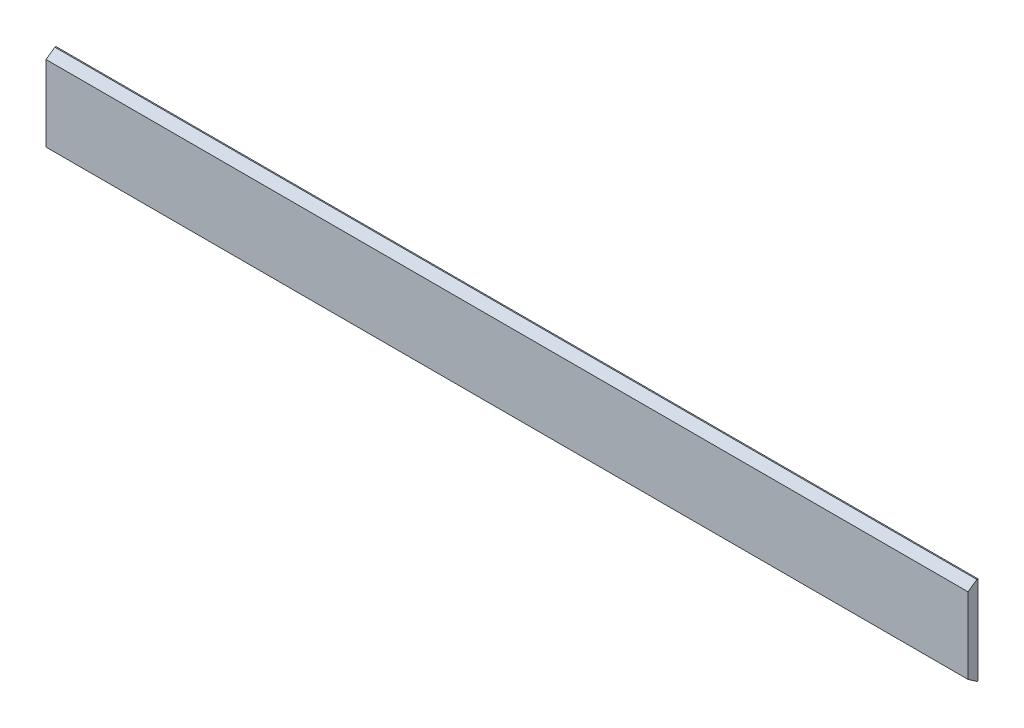
ISO-10303-21;
HEADER;
FILE_DESCRIPTION(('STEP AP214'),'2;1');
FILE_NAME('part.step','',(''),(''),'','','');
FILE_SCHEMA(('AUTOMOTIVE_DESIGN { 1 0 10303 214 1 1 1 1 }'));
ENDSEC;
DATA;
#1=APPLICATION_CONTEXT('core data for automotive mechanical design processes');
#2=APPLICATION_PROTOCOL_DEFINITION('international standard','automotive_design',2000,#1);
#3=PRODUCT_CONTEXT('',#1,'mechanical');
#4=PRODUCT('Part','Part','',(#3));
#5=PRODUCT_RELATED_PRODUCT_CATEGORY('part','',(#4));
#6=PRODUCT_DEFINITION_FORMATION('','',#4);
#7=PRODUCT_DEFINITION_CONTEXT('part definition',#1,'design');
#8=PRODUCT_DEFINITION('design','',#6,#7);
#9=PRODUCT_DEFINITION_SHAPE('','',#8);
#10=(LENGTH_UNIT() NAMED_UNIT(*) SI_UNIT(.MILLI.,.METRE.));
#11=(NAMED_UNIT(*) PLANE_ANGLE_UNIT() SI_UNIT($,.RADIAN.));
#12=(NAMED_UNIT(*) SI_UNIT($,.STERADIAN.) SOLID_ANGLE_UNIT());
#13=UNCERTAINTY_MEASURE_WITH_UNIT(LENGTH_MEASURE(1.E-05),#10,'distance_accuracy_value','');
#14=(GEOMETRIC_REPRESENTATION_CONTEXT(3) GLOBAL_UNCERTAINTY_ASSIGNED_CONTEXT((#13)) GLOBAL_UNIT_ASSIGNED_CONTEXT((#10,
#11,#12)) REPRESENTATION_CONTEXT('',''));
#15=CARTESIAN_POINT('',(0.,0.,0.));
#16=DIRECTION('',(0.,0.,1.));
#17=DIRECTION('',(1.,0.,0.));
#18=AXIS2_PLACEMENT_3D('',#15,#16,#17);
#19=CARTESIAN_POINT('',(830.,79.5,18.));
#20=DIRECTION('',(-1.,0.,0.));
#21=DIRECTION('',(0.,-1.,0.));
#22=AXIS2_PLACEMENT_3D('',#19,#20,#21);
#23=PLANE('',#22);
#24=DIRECTION('',(0.,1.,0.));
#25=VECTOR('',#24,1.);
#26=CARTESIAN_POINT('',(830.,79.5,18.));
#27=LINE('',#26,#25);
#28=CARTESIAN_POINT('',(830.,-68.2966793886447,18.));
#29=VERTEX_POINT('',#28);
#30=CARTESIAN_POINT('',(830.,68.2966793886448,18.));
#31=VERTEX_POINT('',#30);
#32=EDGE_CURVE('E120',#29,#31,#27,.T.);
#33=ORIENTED_EDGE('',*,*,#32,.F.);
#34=DIRECTION('',(0.,-0.573576436351041,-0.819152044288996));
#35=VECTOR('',#34,1.);
#36=CARTESIAN_POINT('',(830.,-68.296679388645,17.9999999999997));
#37=LINE('',#36,#35);
#38=CARTESIAN_POINT('',(830.,-79.5,1.99999999999998));
#39=VERTEX_POINT('',#38);
#40=EDGE_CURVE('E59',#29,#39,#37,.T.);
#41=ORIENTED_EDGE('',*,*,#40,.T.);
#42=DIRECTION('',(0.,0.,-1.));
#43=VECTOR('',#42,1.);
#44=CARTESIAN_POINT('',(830.,-79.5,18.));
#45=LINE('',#44,#43);
#46=CARTESIAN_POINT('',(830.,-79.5,0.));
#47=VERTEX_POINT('',#46);
#48=EDGE_CURVE('E110',#39,#47,#45,.T.);
#49=ORIENTED_EDGE('',*,*,#48,.T.);
#50=DIRECTION('',(0.,1.,0.));
#51=VECTOR('',#50,1.);
#52=CARTESIAN_POINT('',(830.,79.5,0.));
#53=LINE('',#52,#51);
#54=CARTESIAN_POINT('',(830.,79.5,0.));
#55=VERTEX_POINT('',#54);
#56=EDGE_CURVE('E106',#47,#55,#53,.T.);
#57=ORIENTED_EDGE('',*,*,#56,.T.);
#58=DIRECTION('',(0.,0.,-1.));
#59=VECTOR('',#58,1.);
#60=CARTESIAN_POINT('',(830.,79.5,18.));
#61=LINE('',#60,#59);
#62=CARTESIAN_POINT('',(830.,79.5,1.99999999999998));
#63=VERTEX_POINT('',#62);
#64=EDGE_CURVE('E88',#63,#55,#61,.T.);
#65=ORIENTED_EDGE('',*,*,#64,.F.);
#66=DIRECTION('',(0.,-0.573576436351041,0.819152044288996));
#67=VECTOR('',#66,1.);
#68=CARTESIAN_POINT('',(830.,68.2966793886446,18.0000000000003));
#69=LINE('',#68,#67);
#70=EDGE_CURVE('E130',#63,#31,#69,.T.);
#71=ORIENTED_EDGE('',*,*,#70,.T.);
#72=EDGE_LOOP('',(#33,#41,#49,#57,#65,#71));
#73=FACE_BOUND('',#72,.T.);
#74=ADVANCED_FACE('F37',(#73),#23,.F.);
#75=CARTESIAN_POINT('',(-830.,79.5,18.));
#76=DIRECTION('',(0.,-1.,0.));
#77=DIRECTION('',(0.,0.,-1.));
#78=AXIS2_PLACEMENT_3D('',#75,#76,#77);
#79=PLANE('',#78);
#80=DIRECTION('',(0.,0.,-1.));
#81=VECTOR('',#80,1.);
#82=CARTESIAN_POINT('',(-830.,79.5,18.));
#83=LINE('',#82,#81);
#84=CARTESIAN_POINT('',(-830.,79.5,1.99999999999998));
#85=VERTEX_POINT('',#84);
#86=CARTESIAN_POINT('',(-830.,79.5,0.));
#87=VERTEX_POINT('',#86);
#88=EDGE_CURVE('E100',#85,#87,#83,.T.);
#89=ORIENTED_EDGE('',*,*,#88,.F.);
#90=DIRECTION('',(1.,0.,0.));
#91=VECTOR('',#90,1.);
#92=CARTESIAN_POINT('',(830.,79.5,1.99999999999998));
#93=LINE('',#92,#91);
#94=EDGE_CURVE('E95',#85,#63,#93,.T.);
#95=ORIENTED_EDGE('',*,*,#94,.T.);
#96=ORIENTED_EDGE('',*,*,#64,.T.);
#97=DIRECTION('',(-1.,0.,0.));
#98=VECTOR('',#97,1.);
#99=CARTESIAN_POINT('',(-830.,79.5,0.));
#100=LINE('',#99,#98);
#101=EDGE_CURVE('E92',#55,#87,#100,.T.);
#102=ORIENTED_EDGE('',*,*,#101,.T.);
#103=EDGE_LOOP('',(#89,#95,#96,#102));
#104=FACE_BOUND('',#103,.T.);
#105=ADVANCED_FACE('F91',(#104),#79,.F.);
#106=CARTESIAN_POINT('',(-830.,79.5,18.));
#107=DIRECTION('',(1.,0.,0.));
#108=DIRECTION('',(0.,1.,0.));
#109=AXIS2_PLACEMENT_3D('',#106,#107,#108);
#110=PLANE('',#109);
#111=DIRECTION('',(0.,0.,-1.));
#112=VECTOR('',#111,1.);
#113=CARTESIAN_POINT('',(-830.,-79.5,18.));
#114=LINE('',#113,#112);
#115=CARTESIAN_POINT('',(-830.,-79.5,1.99999999999998));
#116=VERTEX_POINT('',#115);
#117=CARTESIAN_POINT('',(-830.,-79.5,0.));
#118=VERTEX_POINT('',#117);
#119=EDGE_CURVE('E122',#116,#118,#114,.T.);
#120=ORIENTED_EDGE('',*,*,#119,.F.);
#121=DIRECTION('',(0.,0.573576436351041,0.819152044288996));
#122=VECTOR('',#121,1.);
#123=CARTESIAN_POINT('',(-830.,-68.2966793886446,18.0000000000003));
#124=LINE('',#123,#122);
#125=CARTESIAN_POINT('',(-830.,-68.2966793886447,18.));
#126=VERTEX_POINT('',#125);
#127=EDGE_CURVE('E11',#116,#126,#124,.T.);
#128=ORIENTED_EDGE('',*,*,#127,.T.);
#129=DIRECTION('',(0.,-1.,0.));
#130=VECTOR('',#129,1.);
#131=CARTESIAN_POINT('',(-830.,79.5,18.));
#132=LINE('',#131,#130);
#133=CARTESIAN_POINT('',(-830.,68.2966793886448,18.));
#134=VERTEX_POINT('',#133);
#135=EDGE_CURVE('E114',#134,#126,#132,.T.);
#136=ORIENTED_EDGE('',*,*,#135,.F.);
#137=DIRECTION('',(0.,0.573576436351041,-0.819152044288996));
#138=VECTOR('',#137,1.);
#139=CARTESIAN_POINT('',(-830.,68.296679388645,17.9999999999997));
#140=LINE('',#139,#138);
#141=EDGE_CURVE('E127',#134,#85,#140,.T.);
#142=ORIENTED_EDGE('',*,*,#141,.T.);
#143=ORIENTED_EDGE('',*,*,#88,.T.);
#144=DIRECTION('',(0.,-1.,0.));
#145=VECTOR('',#144,1.);
#146=CARTESIAN_POINT('',(-830.,79.5,0.));
#147=LINE('',#146,#145);
#148=EDGE_CURVE('E108',#87,#118,#147,.T.);
#149=ORIENTED_EDGE('',*,*,#148,.T.);
#150=EDGE_LOOP('',(#120,#128,#136,#142,#143,#149));
#151=FACE_BOUND('',#150,.T.);
#152=ADVANCED_FACE('F146',(#151),#110,.F.);
#153=CARTESIAN_POINT('',(-830.,-79.5,18.));
#154=DIRECTION('',(0.,1.,0.));
#155=DIRECTION('',(0.,0.,1.));
#156=AXIS2_PLACEMENT_3D('',#153,#154,#155);
#157=PLANE('',#156);
#158=ORIENTED_EDGE('',*,*,#48,.F.);
#159=DIRECTION('',(-1.,0.,0.));
#160=VECTOR('',#159,1.);
#161=CARTESIAN_POINT('',(-830.,-79.5,1.99999999999998));
#162=LINE('',#161,#160);
#163=EDGE_CURVE('E45',#39,#116,#162,.T.);
#164=ORIENTED_EDGE('',*,*,#163,.T.);
#165=ORIENTED_EDGE('',*,*,#119,.T.);
#166=DIRECTION('',(1.,0.,0.));
#167=VECTOR('',#166,1.);
#168=CARTESIAN_POINT('',(-830.,-79.5,0.));
#169=LINE('',#168,#167);
#170=EDGE_CURVE('E118',#118,#47,#169,.T.);
#171=ORIENTED_EDGE('',*,*,#170,.T.);
#172=EDGE_LOOP('',(#158,#164,#165,#171));
#173=FACE_BOUND('',#172,.T.);
#174=ADVANCED_FACE('F160',(#173),#157,.F.);
#175=CARTESIAN_POINT('',(0.,0.,18.));
#176=DIRECTION('',(0.,0.,1.));
#177=DIRECTION('',(1.,0.,0.));
#178=AXIS2_PLACEMENT_3D('',#175,#176,#177);
#179=PLANE('',#178);
#180=ORIENTED_EDGE('',*,*,#135,.T.);
#181=DIRECTION('',(1.,0.,0.));
#182=VECTOR('',#181,1.);
#183=CARTESIAN_POINT('',(830.,-68.2966793886448,18.));
#184=LINE('',#183,#182);
#185=EDGE_CURVE('E132',#126,#29,#184,.T.);
#186=ORIENTED_EDGE('',*,*,#185,.T.);
#187=ORIENTED_EDGE('',*,*,#32,.T.);
#188=DIRECTION('',(-1.,0.,0.));
#189=VECTOR('',#188,1.);
#190=CARTESIAN_POINT('',(-830.,68.2966793886448,18.));
#191=LINE('',#190,#189);
#192=EDGE_CURVE('E99',#31,#134,#191,.T.);
#193=ORIENTED_EDGE('',*,*,#192,.T.);
#194=EDGE_LOOP('',(#180,#186,#187,#193));
#195=FACE_BOUND('',#194,.T.);
#196=ADVANCED_FACE('F138',(#195),#179,.T.);
#197=CARTESIAN_POINT('',(0.,0.,0.));
#198=DIRECTION('',(0.,0.,1.));
#199=DIRECTION('',(1.,0.,0.));
#200=AXIS2_PLACEMENT_3D('',#197,#198,#199);
#201=PLANE('',#200);
#202=ORIENTED_EDGE('',*,*,#56,.F.);
#203=ORIENTED_EDGE('',*,*,#170,.F.);
#204=ORIENTED_EDGE('',*,*,#148,.F.);
#205=ORIENTED_EDGE('',*,*,#101,.F.);
#206=EDGE_LOOP('',(#202,#203,#204,#205));
#207=FACE_BOUND('',#206,.T.);
#208=ADVANCED_FACE('F104',(#207),#201,.F.);
#209=CARTESIAN_POINT('',(0.,68.2966793886448,18.));
#210=DIRECTION('',(0.,0.819152044288996,0.573576436351041));
#211=DIRECTION('',(1.,0.,0.));
#212=AXIS2_PLACEMENT_3D('',#209,#210,#211);
#213=PLANE('',#212);
#214=ORIENTED_EDGE('',*,*,#70,.F.);
#215=ORIENTED_EDGE('',*,*,#94,.F.);
#216=ORIENTED_EDGE('',*,*,#141,.F.);
#217=ORIENTED_EDGE('',*,*,#192,.F.);
#218=EDGE_LOOP('',(#214,#215,#216,#217));
#219=FACE_BOUND('',#218,.T.);
#220=ADVANCED_FACE('F144',(#219),#213,.T.);
#221=CARTESIAN_POINT('',(0.,-68.2966793886448,18.));
#222=DIRECTION('',(0.,-0.819152044288996,0.573576436351041));
#223=DIRECTION('',(-1.,0.,0.));
#224=AXIS2_PLACEMENT_3D('',#221,#222,#223);
#225=PLANE('',#224);
#226=ORIENTED_EDGE('',*,*,#127,.F.);
#227=ORIENTED_EDGE('',*,*,#163,.F.);
#228=ORIENTED_EDGE('',*,*,#40,.F.);
#229=ORIENTED_EDGE('',*,*,#185,.F.);
#230=EDGE_LOOP('',(#226,#227,#228,#229));
#231=FACE_BOUND('',#230,.T.);
#232=ADVANCED_FACE('F39',(#231),#225,.T.);
#233=CLOSED_SHELL('',(#74,#105,#152,#174,#196,#208,#220,#232));
#234=MANIFOLD_SOLID_BREP('B2',#233);
#235=ADVANCED_BREP_SHAPE_REPRESENTATION('',(#18,#234),#14);
#236=SHAPE_DEFINITION_REPRESENTATION(#9,#235);
ENDSEC;
END-ISO-10303-21;
